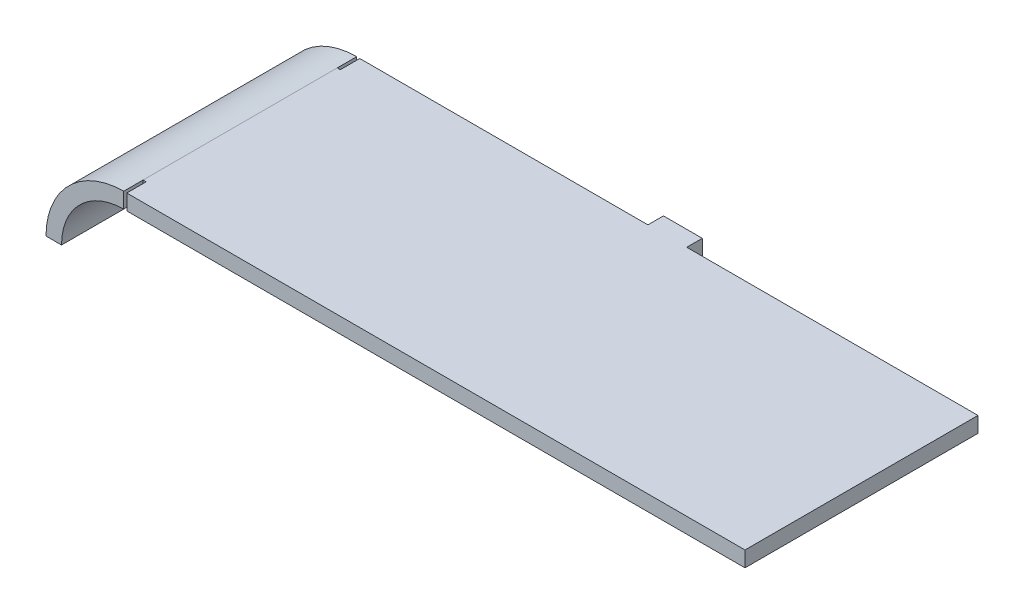
ISO-10303-21;
HEADER;
FILE_DESCRIPTION(('STEP AP214'),'2;1');
FILE_NAME('part.step','',(''),(''),'','','');
FILE_SCHEMA(('AUTOMOTIVE_DESIGN { 1 0 10303 214 1 1 1 1 }'));
ENDSEC;
DATA;
#1=APPLICATION_CONTEXT('core data for automotive mechanical design processes');
#2=APPLICATION_PROTOCOL_DEFINITION('international standard','automotive_design',2000,#1);
#3=PRODUCT_CONTEXT('',#1,'mechanical');
#4=PRODUCT('Part','Part','',(#3));
#5=PRODUCT_RELATED_PRODUCT_CATEGORY('part','',(#4));
#6=PRODUCT_DEFINITION_FORMATION('','',#4);
#7=PRODUCT_DEFINITION_CONTEXT('part definition',#1,'design');
#8=PRODUCT_DEFINITION('design','',#6,#7);
#9=PRODUCT_DEFINITION_SHAPE('','',#8);
#10=(LENGTH_UNIT() NAMED_UNIT(*) SI_UNIT(.MILLI.,.METRE.));
#11=(NAMED_UNIT(*) PLANE_ANGLE_UNIT() SI_UNIT($,.RADIAN.));
#12=(NAMED_UNIT(*) SI_UNIT($,.STERADIAN.) SOLID_ANGLE_UNIT());
#13=UNCERTAINTY_MEASURE_WITH_UNIT(LENGTH_MEASURE(1.E-05),#10,'distance_accuracy_value','');
#14=(GEOMETRIC_REPRESENTATION_CONTEXT(3) GLOBAL_UNCERTAINTY_ASSIGNED_CONTEXT((#13)) GLOBAL_UNIT_ASSIGNED_CONTEXT((#10,
#11,#12)) REPRESENTATION_CONTEXT('',''));
#15=CARTESIAN_POINT('',(0.,0.,0.));
#16=DIRECTION('',(0.,0.,1.));
#17=DIRECTION('',(1.,0.,0.));
#18=AXIS2_PLACEMENT_3D('',#15,#16,#17);
#19=CARTESIAN_POINT('',(-652.,460.,150.));
#20=DIRECTION('',(0.,1.,0.));
#21=DIRECTION('',(0.,0.,1.));
#22=AXIS2_PLACEMENT_3D('',#19,#20,#21);
#23=PLANE('',#22);
#24=DIRECTION('',(1.,0.,0.));
#25=VECTOR('',#24,1.);
#26=CARTESIAN_POINT('',(-652.,460.,152.5));
#27=LINE('',#26,#25);
#28=CARTESIAN_POINT('',(-700.,460.,152.5));
#29=VERTEX_POINT('',#28);
#30=CARTESIAN_POINT('',(-699.6,460.,152.5));
#31=VERTEX_POINT('',#30);
#32=EDGE_CURVE('E307',#29,#31,#27,.T.);
#33=ORIENTED_EDGE('',*,*,#32,.F.);
#34=DIRECTION('',(0.,0.,-1.));
#35=VECTOR('',#34,1.);
#36=CARTESIAN_POINT('',(-700.,460.,180.));
#37=LINE('',#36,#35);
#38=CARTESIAN_POINT('',(-700.,460.,177.5));
#39=VERTEX_POINT('',#38);
#40=EDGE_CURVE('E310',#39,#29,#37,.T.);
#41=ORIENTED_EDGE('',*,*,#40,.F.);
#42=DIRECTION('',(-1.,0.,0.));
#43=VECTOR('',#42,1.);
#44=CARTESIAN_POINT('',(-652.,460.,177.5));
#45=LINE('',#44,#43);
#46=CARTESIAN_POINT('',(-699.6,460.,177.5));
#47=VERTEX_POINT('',#46);
#48=EDGE_CURVE('E320',#47,#39,#45,.T.);
#49=ORIENTED_EDGE('',*,*,#48,.F.);
#50=DIRECTION('',(0.,0.,-1.));
#51=VECTOR('',#50,1.);
#52=CARTESIAN_POINT('',(-699.6,460.,150.));
#53=LINE('',#52,#51);
#54=CARTESIAN_POINT('',(-699.6,460.,180.));
#55=VERTEX_POINT('',#54);
#56=EDGE_CURVE('E323',#55,#47,#53,.T.);
#57=ORIENTED_EDGE('',*,*,#56,.F.);
#58=DIRECTION('',(-1.,0.,0.));
#59=VECTOR('',#58,1.);
#60=CARTESIAN_POINT('',(-620.,460.,180.));
#61=LINE('',#60,#59);
#62=CARTESIAN_POINT('',(-620.,460.,180.));
#63=VERTEX_POINT('',#62);
#64=EDGE_CURVE('E327',#63,#55,#61,.T.);
#65=ORIENTED_EDGE('',*,*,#64,.F.);
#66=DIRECTION('',(0.,0.,-1.));
#67=VECTOR('',#66,1.);
#68=CARTESIAN_POINT('',(-620.,460.,150.));
#69=LINE('',#68,#67);
#70=CARTESIAN_POINT('',(-620.,460.,150.));
#71=VERTEX_POINT('',#70);
#72=EDGE_CURVE('E331',#63,#71,#69,.T.);
#73=ORIENTED_EDGE('',*,*,#72,.T.);
#74=DIRECTION('',(-1.,0.,0.));
#75=VECTOR('',#74,1.);
#76=CARTESIAN_POINT('',(-620.,460.,150.));
#77=LINE('',#76,#75);
#78=CARTESIAN_POINT('',(-657.5,460.,150.));
#79=VERTEX_POINT('',#78);
#80=EDGE_CURVE('E261',#71,#79,#77,.T.);
#81=ORIENTED_EDGE('',*,*,#80,.T.);
#82=DIRECTION('',(0.,0.,-1.));
#83=VECTOR('',#82,1.);
#84=CARTESIAN_POINT('',(-657.5,460.,150.));
#85=LINE('',#84,#83);
#86=CARTESIAN_POINT('',(-657.5,460.,148.));
#87=VERTEX_POINT('',#86);
#88=EDGE_CURVE('E339',#79,#87,#85,.T.);
#89=ORIENTED_EDGE('',*,*,#88,.T.);
#90=DIRECTION('',(-1.,0.,0.));
#91=VECTOR('',#90,1.);
#92=CARTESIAN_POINT('',(-662.5,460.,148.));
#93=LINE('',#92,#91);
#94=CARTESIAN_POINT('',(-662.5,460.,148.));
#95=VERTEX_POINT('',#94);
#96=EDGE_CURVE('E342',#87,#95,#93,.T.);
#97=ORIENTED_EDGE('',*,*,#96,.T.);
#98=DIRECTION('',(0.,0.,1.));
#99=VECTOR('',#98,1.);
#100=CARTESIAN_POINT('',(-662.5,460.,150.));
#101=LINE('',#100,#99);
#102=CARTESIAN_POINT('',(-662.5,460.,150.));
#103=VERTEX_POINT('',#102);
#104=EDGE_CURVE('E259',#95,#103,#101,.T.);
#105=ORIENTED_EDGE('',*,*,#104,.T.);
#106=CARTESIAN_POINT('',(-699.6,460.,150.));
#107=VERTEX_POINT('',#106);
#108=EDGE_CURVE('E243',#103,#107,#77,.T.);
#109=ORIENTED_EDGE('',*,*,#108,.T.);
#110=DIRECTION('',(0.,0.,-1.));
#111=VECTOR('',#110,1.);
#112=CARTESIAN_POINT('',(-699.6,460.,150.));
#113=LINE('',#112,#111);
#114=EDGE_CURVE('E251',#31,#107,#113,.T.);
#115=ORIENTED_EDGE('',*,*,#114,.F.);
#116=EDGE_LOOP('',(#33,#41,#49,#57,#65,#73,#81,#89,#97,#105,#109,#115));
#117=FACE_BOUND('',#116,.T.);
#118=ADVANCED_FACE('F49',(#117),#23,.T.);
#119=CARTESIAN_POINT('',(-700.,287.674726171696,152.5));
#120=DIRECTION('',(0.,0.,-1.));
#121=DIRECTION('',(-1.,0.,0.));
#122=AXIS2_PLACEMENT_3D('',#119,#120,#121);
#123=PLANE('',#122);
#124=DIRECTION('',(0.,1.,0.));
#125=VECTOR('',#124,1.);
#126=CARTESIAN_POINT('',(-700.,287.674726171696,152.5));
#127=LINE('',#126,#125);
#128=CARTESIAN_POINT('',(-700.,458.,152.5));
#129=VERTEX_POINT('',#128);
#130=EDGE_CURVE('E207',#129,#29,#127,.T.);
#131=ORIENTED_EDGE('',*,*,#130,.T.);
#132=ORIENTED_EDGE('',*,*,#32,.T.);
#133=DIRECTION('',(0.,1.,0.));
#134=VECTOR('',#133,1.);
#135=CARTESIAN_POINT('',(-699.6,287.674726171696,152.5));
#136=LINE('',#135,#134);
#137=CARTESIAN_POINT('',(-699.6,458.,152.5));
#138=VERTEX_POINT('',#137);
#139=EDGE_CURVE('E13',#138,#31,#136,.T.);
#140=ORIENTED_EDGE('',*,*,#139,.F.);
#141=DIRECTION('',(-1.,0.,0.));
#142=VECTOR('',#141,1.);
#143=CARTESIAN_POINT('',(-700.,458.,152.5));
#144=LINE('',#143,#142);
#145=EDGE_CURVE('E255',#138,#129,#144,.T.);
#146=ORIENTED_EDGE('',*,*,#145,.T.);
#147=EDGE_LOOP('',(#131,#132,#140,#146));
#148=FACE_BOUND('',#147,.T.);
#149=ADVANCED_FACE('F51',(#148),#123,.T.);
#150=CARTESIAN_POINT('',(-699.6,287.674726171696,152.5));
#151=DIRECTION('',(-1.,0.,0.));
#152=DIRECTION('',(0.,0.,1.));
#153=AXIS2_PLACEMENT_3D('',#150,#151,#152);
#154=PLANE('',#153);
#155=ORIENTED_EDGE('',*,*,#139,.T.);
#156=ORIENTED_EDGE('',*,*,#114,.T.);
#157=DIRECTION('',(0.,1.,0.));
#158=VECTOR('',#157,1.);
#159=CARTESIAN_POINT('',(-699.6,287.674726171696,150.));
#160=LINE('',#159,#158);
#161=CARTESIAN_POINT('',(-699.6,458.,150.));
#162=VERTEX_POINT('',#161);
#163=EDGE_CURVE('E57',#162,#107,#160,.T.);
#164=ORIENTED_EDGE('',*,*,#163,.F.);
#165=DIRECTION('',(0.,0.,1.));
#166=VECTOR('',#165,1.);
#167=CARTESIAN_POINT('',(-699.6,458.,152.5));
#168=LINE('',#167,#166);
#169=EDGE_CURVE('E249',#162,#138,#168,.T.);
#170=ORIENTED_EDGE('',*,*,#169,.T.);
#171=EDGE_LOOP('',(#155,#156,#164,#170));
#172=FACE_BOUND('',#171,.T.);
#173=ADVANCED_FACE('F248',(#172),#154,.T.);
#174=CARTESIAN_POINT('',(-652.,287.674726171696,150.));
#175=DIRECTION('',(0.,0.,-1.));
#176=DIRECTION('',(-1.,0.,0.));
#177=AXIS2_PLACEMENT_3D('',#174,#175,#176);
#178=PLANE('',#177);
#179=ORIENTED_EDGE('',*,*,#163,.T.);
#180=ORIENTED_EDGE('',*,*,#108,.F.);
#181=DIRECTION('',(0.,1.,0.));
#182=VECTOR('',#181,1.);
#183=CARTESIAN_POINT('',(-662.5,287.674726171696,150.));
#184=LINE('',#183,#182);
#185=CARTESIAN_POINT('',(-662.5,458.,150.));
#186=VERTEX_POINT('',#185);
#187=EDGE_CURVE('E234',#186,#103,#184,.T.);
#188=ORIENTED_EDGE('',*,*,#187,.F.);
#189=DIRECTION('',(-1.,0.,0.));
#190=VECTOR('',#189,1.);
#191=CARTESIAN_POINT('',(-652.,458.,150.));
#192=LINE('',#191,#190);
#193=EDGE_CURVE('E244',#186,#162,#192,.T.);
#194=ORIENTED_EDGE('',*,*,#193,.T.);
#195=EDGE_LOOP('',(#179,#180,#188,#194));
#196=FACE_BOUND('',#195,.T.);
#197=ADVANCED_FACE('F241',(#196),#178,.T.);
#198=CARTESIAN_POINT('',(-662.5,287.674726171696,150.));
#199=DIRECTION('',(-1.,0.,0.));
#200=DIRECTION('',(0.,0.,1.));
#201=AXIS2_PLACEMENT_3D('',#198,#199,#200);
#202=PLANE('',#201);
#203=ORIENTED_EDGE('',*,*,#187,.T.);
#204=ORIENTED_EDGE('',*,*,#104,.F.);
#205=DIRECTION('',(0.,1.,0.));
#206=VECTOR('',#205,1.);
#207=CARTESIAN_POINT('',(-662.5,287.674726171696,148.));
#208=LINE('',#207,#206);
#209=CARTESIAN_POINT('',(-662.5,458.,148.));
#210=VERTEX_POINT('',#209);
#211=EDGE_CURVE('E231',#210,#95,#208,.T.);
#212=ORIENTED_EDGE('',*,*,#211,.F.);
#213=DIRECTION('',(0.,0.,1.));
#214=VECTOR('',#213,1.);
#215=CARTESIAN_POINT('',(-662.5,458.,150.));
#216=LINE('',#215,#214);
#217=EDGE_CURVE('E278',#210,#186,#216,.T.);
#218=ORIENTED_EDGE('',*,*,#217,.T.);
#219=EDGE_LOOP('',(#203,#204,#212,#218));
#220=FACE_BOUND('',#219,.T.);
#221=ADVANCED_FACE('F348',(#220),#202,.T.);
#222=CARTESIAN_POINT('',(-662.5,287.674726171696,148.));
#223=DIRECTION('',(0.,0.,-1.));
#224=DIRECTION('',(-1.,0.,0.));
#225=AXIS2_PLACEMENT_3D('',#222,#223,#224);
#226=PLANE('',#225);
#227=ORIENTED_EDGE('',*,*,#211,.T.);
#228=ORIENTED_EDGE('',*,*,#96,.F.);
#229=DIRECTION('',(0.,1.,0.));
#230=VECTOR('',#229,1.);
#231=CARTESIAN_POINT('',(-657.5,287.674726171696,148.));
#232=LINE('',#231,#230);
#233=CARTESIAN_POINT('',(-657.5,458.,148.));
#234=VERTEX_POINT('',#233);
#235=EDGE_CURVE('E228',#234,#87,#232,.T.);
#236=ORIENTED_EDGE('',*,*,#235,.F.);
#237=DIRECTION('',(-1.,0.,0.));
#238=VECTOR('',#237,1.);
#239=CARTESIAN_POINT('',(-662.5,458.,148.));
#240=LINE('',#239,#238);
#241=EDGE_CURVE('E354',#234,#210,#240,.T.);
#242=ORIENTED_EDGE('',*,*,#241,.T.);
#243=EDGE_LOOP('',(#227,#228,#236,#242));
#244=FACE_BOUND('',#243,.T.);
#245=ADVANCED_FACE('F352',(#244),#226,.T.);
#246=CARTESIAN_POINT('',(-657.5,287.674726171696,150.));
#247=DIRECTION('',(1.,0.,0.));
#248=DIRECTION('',(0.,0.,-1.));
#249=AXIS2_PLACEMENT_3D('',#246,#247,#248);
#250=PLANE('',#249);
#251=ORIENTED_EDGE('',*,*,#235,.T.);
#252=ORIENTED_EDGE('',*,*,#88,.F.);
#253=DIRECTION('',(0.,1.,0.));
#254=VECTOR('',#253,1.);
#255=CARTESIAN_POINT('',(-657.5,287.674726171696,150.));
#256=LINE('',#255,#254);
#257=CARTESIAN_POINT('',(-657.5,458.,150.));
#258=VERTEX_POINT('',#257);
#259=EDGE_CURVE('E225',#258,#79,#256,.T.);
#260=ORIENTED_EDGE('',*,*,#259,.F.);
#261=DIRECTION('',(0.,0.,-1.));
#262=VECTOR('',#261,1.);
#263=CARTESIAN_POINT('',(-657.5,458.,150.));
#264=LINE('',#263,#262);
#265=EDGE_CURVE('E295',#258,#234,#264,.T.);
#266=ORIENTED_EDGE('',*,*,#265,.T.);
#267=EDGE_LOOP('',(#251,#252,#260,#266));
#268=FACE_BOUND('',#267,.T.);
#269=ADVANCED_FACE('F410',(#268),#250,.T.);
#270=ORIENTED_EDGE('',*,*,#259,.T.);
#271=ORIENTED_EDGE('',*,*,#80,.F.);
#272=DIRECTION('',(0.,1.,0.));
#273=VECTOR('',#272,1.);
#274=CARTESIAN_POINT('',(-620.,287.674726171696,150.));
#275=LINE('',#274,#273);
#276=CARTESIAN_POINT('',(-620.,458.,150.));
#277=VERTEX_POINT('',#276);
#278=EDGE_CURVE('E222',#277,#71,#275,.T.);
#279=ORIENTED_EDGE('',*,*,#278,.F.);
#280=EDGE_CURVE('E279',#277,#258,#192,.T.);
#281=ORIENTED_EDGE('',*,*,#280,.T.);
#282=EDGE_LOOP('',(#270,#271,#279,#281));
#283=FACE_BOUND('',#282,.T.);
#284=ADVANCED_FACE('F406',(#283),#178,.T.);
#285=CARTESIAN_POINT('',(-620.,287.674726171696,150.));
#286=DIRECTION('',(1.,0.,0.));
#287=DIRECTION('',(0.,0.,-1.));
#288=AXIS2_PLACEMENT_3D('',#285,#286,#287);
#289=PLANE('',#288);
#290=ORIENTED_EDGE('',*,*,#278,.T.);
#291=ORIENTED_EDGE('',*,*,#72,.F.);
#292=DIRECTION('',(0.,1.,0.));
#293=VECTOR('',#292,1.);
#294=CARTESIAN_POINT('',(-620.,287.674726171696,180.));
#295=LINE('',#294,#293);
#296=CARTESIAN_POINT('',(-620.,458.,180.));
#297=VERTEX_POINT('',#296);
#298=EDGE_CURVE('E219',#297,#63,#295,.T.);
#299=ORIENTED_EDGE('',*,*,#298,.F.);
#300=DIRECTION('',(0.,0.,-1.));
#301=VECTOR('',#300,1.);
#302=CARTESIAN_POINT('',(-620.,458.,150.));
#303=LINE('',#302,#301);
#304=EDGE_CURVE('E292',#297,#277,#303,.T.);
#305=ORIENTED_EDGE('',*,*,#304,.T.);
#306=EDGE_LOOP('',(#290,#291,#299,#305));
#307=FACE_BOUND('',#306,.T.);
#308=ADVANCED_FACE('F401',(#307),#289,.T.);
#309=CARTESIAN_POINT('',(-620.,287.674726171696,180.));
#310=DIRECTION('',(0.,0.,1.));
#311=DIRECTION('',(1.,0.,0.));
#312=AXIS2_PLACEMENT_3D('',#309,#310,#311);
#313=PLANE('',#312);
#314=ORIENTED_EDGE('',*,*,#298,.T.);
#315=ORIENTED_EDGE('',*,*,#64,.T.);
#316=DIRECTION('',(0.,1.,0.));
#317=VECTOR('',#316,1.);
#318=CARTESIAN_POINT('',(-699.6,287.674726171696,180.));
#319=LINE('',#318,#317);
#320=CARTESIAN_POINT('',(-699.6,458.,180.));
#321=VERTEX_POINT('',#320);
#322=EDGE_CURVE('E216',#321,#55,#319,.T.);
#323=ORIENTED_EDGE('',*,*,#322,.F.);
#324=DIRECTION('',(1.,0.,0.));
#325=VECTOR('',#324,1.);
#326=CARTESIAN_POINT('',(-620.,458.,180.));
#327=LINE('',#326,#325);
#328=EDGE_CURVE('E69',#321,#297,#327,.T.);
#329=ORIENTED_EDGE('',*,*,#328,.T.);
#330=EDGE_LOOP('',(#314,#315,#323,#329));
#331=FACE_BOUND('',#330,.T.);
#332=ADVANCED_FACE('F398',(#331),#313,.T.);
#333=CARTESIAN_POINT('',(-699.6,287.674726171696,177.5));
#334=DIRECTION('',(-1.,0.,0.));
#335=DIRECTION('',(0.,0.,1.));
#336=AXIS2_PLACEMENT_3D('',#333,#334,#335);
#337=PLANE('',#336);
#338=ORIENTED_EDGE('',*,*,#322,.T.);
#339=ORIENTED_EDGE('',*,*,#56,.T.);
#340=DIRECTION('',(0.,1.,0.));
#341=VECTOR('',#340,1.);
#342=CARTESIAN_POINT('',(-699.6,287.674726171696,177.5));
#343=LINE('',#342,#341);
#344=CARTESIAN_POINT('',(-699.6,458.,177.5));
#345=VERTEX_POINT('',#344);
#346=EDGE_CURVE('E213',#345,#47,#343,.T.);
#347=ORIENTED_EDGE('',*,*,#346,.F.);
#348=DIRECTION('',(0.,0.,1.));
#349=VECTOR('',#348,1.);
#350=CARTESIAN_POINT('',(-699.6,458.,177.5));
#351=LINE('',#350,#349);
#352=EDGE_CURVE('E64',#345,#321,#351,.T.);
#353=ORIENTED_EDGE('',*,*,#352,.T.);
#354=EDGE_LOOP('',(#338,#339,#347,#353));
#355=FACE_BOUND('',#354,.T.);
#356=ADVANCED_FACE('F394',(#355),#337,.T.);
#357=CARTESIAN_POINT('',(-700.,287.674726171696,177.5));
#358=DIRECTION('',(0.,0.,1.));
#359=DIRECTION('',(1.,0.,0.));
#360=AXIS2_PLACEMENT_3D('',#357,#358,#359);
#361=PLANE('',#360);
#362=ORIENTED_EDGE('',*,*,#346,.T.);
#363=ORIENTED_EDGE('',*,*,#48,.T.);
#364=DIRECTION('',(0.,1.,0.));
#365=VECTOR('',#364,1.);
#366=CARTESIAN_POINT('',(-700.,287.674726171696,177.5));
#367=LINE('',#366,#365);
#368=CARTESIAN_POINT('',(-700.,458.,177.5));
#369=VERTEX_POINT('',#368);
#370=EDGE_CURVE('E186',#369,#39,#367,.T.);
#371=ORIENTED_EDGE('',*,*,#370,.F.);
#372=DIRECTION('',(1.,0.,0.));
#373=VECTOR('',#372,1.);
#374=CARTESIAN_POINT('',(-700.,458.,177.5));
#375=LINE('',#374,#373);
#376=EDGE_CURVE('E208',#369,#345,#375,.T.);
#377=ORIENTED_EDGE('',*,*,#376,.T.);
#378=EDGE_LOOP('',(#362,#363,#371,#377));
#379=FACE_BOUND('',#378,.T.);
#380=ADVANCED_FACE('F391',(#379),#361,.T.);
#381=CARTESIAN_POINT('',(-652.,458.,150.));
#382=DIRECTION('',(0.,-1.,0.));
#383=DIRECTION('',(0.,0.,-1.));
#384=AXIS2_PLACEMENT_3D('',#381,#382,#383);
#385=PLANE('',#384);
#386=ORIENTED_EDGE('',*,*,#145,.F.);
#387=ORIENTED_EDGE('',*,*,#169,.F.);
#388=ORIENTED_EDGE('',*,*,#193,.F.);
#389=ORIENTED_EDGE('',*,*,#217,.F.);
#390=ORIENTED_EDGE('',*,*,#241,.F.);
#391=ORIENTED_EDGE('',*,*,#265,.F.);
#392=ORIENTED_EDGE('',*,*,#280,.F.);
#393=ORIENTED_EDGE('',*,*,#304,.F.);
#394=ORIENTED_EDGE('',*,*,#328,.F.);
#395=ORIENTED_EDGE('',*,*,#352,.F.);
#396=ORIENTED_EDGE('',*,*,#376,.F.);
#397=DIRECTION('',(0.,0.,1.));
#398=VECTOR('',#397,1.);
#399=CARTESIAN_POINT('',(-700.,458.,148.));
#400=LINE('',#399,#398);
#401=EDGE_CURVE('E202',#129,#369,#400,.T.);
#402=ORIENTED_EDGE('',*,*,#401,.F.);
#403=EDGE_LOOP('',(#386,#387,#388,#389,#390,#391,#392,#393,#394,#395,#396,#402));
#404=FACE_BOUND('',#403,.T.);
#405=ADVANCED_FACE('F357',(#404),#385,.T.);
#406=CARTESIAN_POINT('',(-700.,450.,150.));
#407=DIRECTION('',(0.,0.,-1.));
#408=DIRECTION('',(-1.,0.,0.));
#409=AXIS2_PLACEMENT_3D('',#406,#407,#408);
#410=PLANE('',#409);
#411=DIRECTION('',(0.,1.,0.));
#412=VECTOR('',#411,1.);
#413=CARTESIAN_POINT('',(-700.,459.,150.));
#414=LINE('',#413,#412);
#415=CARTESIAN_POINT('',(-700.,458.,150.));
#416=VERTEX_POINT('',#415);
#417=CARTESIAN_POINT('',(-700.,460.,150.));
#418=VERTEX_POINT('',#417);
#419=EDGE_CURVE('E304',#416,#418,#414,.T.);
#420=ORIENTED_EDGE('',*,*,#419,.F.);
#421=CARTESIAN_POINT('',(-700.,450.,150.));
#422=DIRECTION('',(0.,0.,-1.));
#423=DIRECTION('',(-1.,0.,0.));
#424=AXIS2_PLACEMENT_3D('',#421,#422,#423);
#425=CIRCLE('',#424,7.99999999999997);
#426=CARTESIAN_POINT('',(-708.,450.,150.));
#427=VERTEX_POINT('',#426);
#428=EDGE_CURVE('E190',#416,#427,#425,.F.);
#429=ORIENTED_EDGE('',*,*,#428,.T.);
#430=DIRECTION('',(-1.,0.,0.));
#431=VECTOR('',#430,1.);
#432=CARTESIAN_POINT('',(-709.,450.,150.));
#433=LINE('',#432,#431);
#434=CARTESIAN_POINT('',(-710.,450.,150.));
#435=VERTEX_POINT('',#434);
#436=EDGE_CURVE('E301',#427,#435,#433,.T.);
#437=ORIENTED_EDGE('',*,*,#436,.T.);
#438=CARTESIAN_POINT('',(-700.,450.,150.));
#439=DIRECTION('',(0.,0.,-1.));
#440=DIRECTION('',(-1.,0.,0.));
#441=AXIS2_PLACEMENT_3D('',#438,#439,#440);
#442=CIRCLE('',#441,9.99999999999998);
#443=EDGE_CURVE('E383',#418,#435,#442,.F.);
#444=ORIENTED_EDGE('',*,*,#443,.F.);
#445=EDGE_LOOP('',(#420,#429,#437,#444));
#446=FACE_BOUND('',#445,.T.);
#447=ADVANCED_FACE('F389',(#446),#410,.T.);
#448=CARTESIAN_POINT('',(-709.,450.,165.));
#449=DIRECTION('',(0.,1.,0.));
#450=DIRECTION('',(0.,0.,-1.));
#451=AXIS2_PLACEMENT_3D('',#448,#449,#450);
#452=PLANE('',#451);
#453=ORIENTED_EDGE('',*,*,#436,.F.);
#454=DIRECTION('',(0.,0.,-1.));
#455=VECTOR('',#454,1.);
#456=CARTESIAN_POINT('',(-708.,450.,278.197504743491));
#457=LINE('',#456,#455);
#458=CARTESIAN_POINT('',(-708.,450.,180.));
#459=VERTEX_POINT('',#458);
#460=EDGE_CURVE('E371',#459,#427,#457,.T.);
#461=ORIENTED_EDGE('',*,*,#460,.F.);
#462=DIRECTION('',(-1.,0.,0.));
#463=VECTOR('',#462,1.);
#464=CARTESIAN_POINT('',(-709.,450.,180.));
#465=LINE('',#464,#463);
#466=CARTESIAN_POINT('',(-710.,450.,180.));
#467=VERTEX_POINT('',#466);
#468=EDGE_CURVE('E170',#459,#467,#465,.T.);
#469=ORIENTED_EDGE('',*,*,#468,.T.);
#470=DIRECTION('',(0.,0.,-1.));
#471=VECTOR('',#470,1.);
#472=CARTESIAN_POINT('',(-710.,450.,278.197504743491));
#473=LINE('',#472,#471);
#474=EDGE_CURVE('E181',#467,#435,#473,.T.);
#475=ORIENTED_EDGE('',*,*,#474,.T.);
#476=EDGE_LOOP('',(#453,#461,#469,#475));
#477=FACE_BOUND('',#476,.T.);
#478=ADVANCED_FACE('F387',(#477),#452,.F.);
#479=CARTESIAN_POINT('',(-700.,450.,180.));
#480=DIRECTION('',(0.,0.,-1.));
#481=DIRECTION('',(-1.,0.,0.));
#482=AXIS2_PLACEMENT_3D('',#479,#480,#481);
#483=PLANE('',#482);
#484=ORIENTED_EDGE('',*,*,#468,.F.);
#485=CARTESIAN_POINT('',(-700.,450.,180.));
#486=DIRECTION('',(0.,0.,-1.));
#487=DIRECTION('',(-1.,0.,0.));
#488=AXIS2_PLACEMENT_3D('',#485,#486,#487);
#489=CIRCLE('',#488,7.99999999999997);
#490=CARTESIAN_POINT('',(-700.,458.,180.));
#491=VERTEX_POINT('',#490);
#492=EDGE_CURVE('E165',#491,#459,#489,.F.);
#493=ORIENTED_EDGE('',*,*,#492,.F.);
#494=DIRECTION('',(0.,1.,0.));
#495=VECTOR('',#494,1.);
#496=CARTESIAN_POINT('',(-700.,459.,180.));
#497=LINE('',#496,#495);
#498=CARTESIAN_POINT('',(-700.,460.,180.));
#499=VERTEX_POINT('',#498);
#500=EDGE_CURVE('E160',#491,#499,#497,.T.);
#501=ORIENTED_EDGE('',*,*,#500,.T.);
#502=CARTESIAN_POINT('',(-700.,450.,180.));
#503=DIRECTION('',(0.,0.,-1.));
#504=DIRECTION('',(-1.,0.,0.));
#505=AXIS2_PLACEMENT_3D('',#502,#503,#504);
#506=CIRCLE('',#505,9.99999999999998);
#507=EDGE_CURVE('E163',#499,#467,#506,.F.);
#508=ORIENTED_EDGE('',*,*,#507,.T.);
#509=EDGE_LOOP('',(#484,#493,#501,#508));
#510=FACE_BOUND('',#509,.T.);
#511=ADVANCED_FACE('F162',(#510),#483,.F.);
#512=CARTESIAN_POINT('',(-700.,459.,178.75));
#513=DIRECTION('',(1.,0.,0.));
#514=DIRECTION('',(0.,0.,-1.));
#515=AXIS2_PLACEMENT_3D('',#512,#513,#514);
#516=PLANE('',#515);
#517=ORIENTED_EDGE('',*,*,#500,.F.);
#518=DIRECTION('',(0.,0.,-1.));
#519=VECTOR('',#518,1.);
#520=CARTESIAN_POINT('',(-700.,458.,278.197504743491));
#521=LINE('',#520,#519);
#522=EDGE_CURVE('E378',#491,#369,#521,.T.);
#523=ORIENTED_EDGE('',*,*,#522,.T.);
#524=ORIENTED_EDGE('',*,*,#370,.T.);
#525=DIRECTION('',(0.,0.,-1.));
#526=VECTOR('',#525,1.);
#527=CARTESIAN_POINT('',(-700.,460.,278.197504743491));
#528=LINE('',#527,#526);
#529=EDGE_CURVE('E178',#499,#39,#528,.T.);
#530=ORIENTED_EDGE('',*,*,#529,.F.);
#531=EDGE_LOOP('',(#517,#523,#524,#530));
#532=FACE_BOUND('',#531,.T.);
#533=ADVANCED_FACE('F184',(#532),#516,.T.);
#534=CARTESIAN_POINT('',(-700.,459.,151.25));
#535=DIRECTION('',(1.,0.,0.));
#536=DIRECTION('',(0.,0.,-1.));
#537=AXIS2_PLACEMENT_3D('',#534,#535,#536);
#538=PLANE('',#537);
#539=DIRECTION('',(0.,0.,-1.));
#540=VECTOR('',#539,1.);
#541=CARTESIAN_POINT('',(-700.,458.,278.197504743491));
#542=LINE('',#541,#540);
#543=EDGE_CURVE('E187',#129,#416,#542,.T.);
#544=ORIENTED_EDGE('',*,*,#543,.T.);
#545=ORIENTED_EDGE('',*,*,#419,.T.);
#546=DIRECTION('',(0.,0.,-1.));
#547=VECTOR('',#546,1.);
#548=CARTESIAN_POINT('',(-700.,460.,278.197504743491));
#549=LINE('',#548,#547);
#550=EDGE_CURVE('E171',#29,#418,#549,.T.);
#551=ORIENTED_EDGE('',*,*,#550,.F.);
#552=ORIENTED_EDGE('',*,*,#130,.F.);
#553=EDGE_LOOP('',(#544,#545,#551,#552));
#554=FACE_BOUND('',#553,.T.);
#555=ADVANCED_FACE('F363',(#554),#538,.T.);
#556=CARTESIAN_POINT('',(-700.,450.,278.197504743491));
#557=DIRECTION('',(0.,0.,-1.));
#558=DIRECTION('',(-1.,0.,0.));
#559=AXIS2_PLACEMENT_3D('',#556,#557,#558);
#560=CYLINDRICAL_SURFACE('',#559,9.99999999999998);
#561=ORIENTED_EDGE('',*,*,#40,.T.);
#562=ORIENTED_EDGE('',*,*,#550,.T.);
#563=ORIENTED_EDGE('',*,*,#443,.T.);
#564=ORIENTED_EDGE('',*,*,#474,.F.);
#565=ORIENTED_EDGE('',*,*,#507,.F.);
#566=ORIENTED_EDGE('',*,*,#529,.T.);
#567=EDGE_LOOP('',(#561,#562,#563,#564,#565,#566));
#568=FACE_BOUND('',#567,.T.);
#569=ADVANCED_FACE('F177',(#568),#560,.T.);
#570=CARTESIAN_POINT('',(-700.,450.,278.197504743491));
#571=DIRECTION('',(0.,0.,-1.));
#572=DIRECTION('',(-1.,0.,0.));
#573=AXIS2_PLACEMENT_3D('',#570,#571,#572);
#574=CYLINDRICAL_SURFACE('',#573,7.99999999999997);
#575=ORIENTED_EDGE('',*,*,#401,.T.);
#576=ORIENTED_EDGE('',*,*,#522,.F.);
#577=ORIENTED_EDGE('',*,*,#492,.T.);
#578=ORIENTED_EDGE('',*,*,#460,.T.);
#579=ORIENTED_EDGE('',*,*,#428,.F.);
#580=ORIENTED_EDGE('',*,*,#543,.F.);
#581=EDGE_LOOP('',(#575,#576,#577,#578,#579,#580));
#582=FACE_BOUND('',#581,.T.);
#583=ADVANCED_FACE('F367',(#582),#574,.F.);
#584=CLOSED_SHELL('',(#118,#149,#173,#197,#221,#245,#269,#284,#308,#332,#356,#380,#405,#447,
#478,#511,#533,#555,#569,#583));
#585=MANIFOLD_SOLID_BREP('B2',#584);
#586=ADVANCED_BREP_SHAPE_REPRESENTATION('',(#18,#585),#14);
#587=SHAPE_DEFINITION_REPRESENTATION(#9,#586);
ENDSEC;
END-ISO-10303-21;
